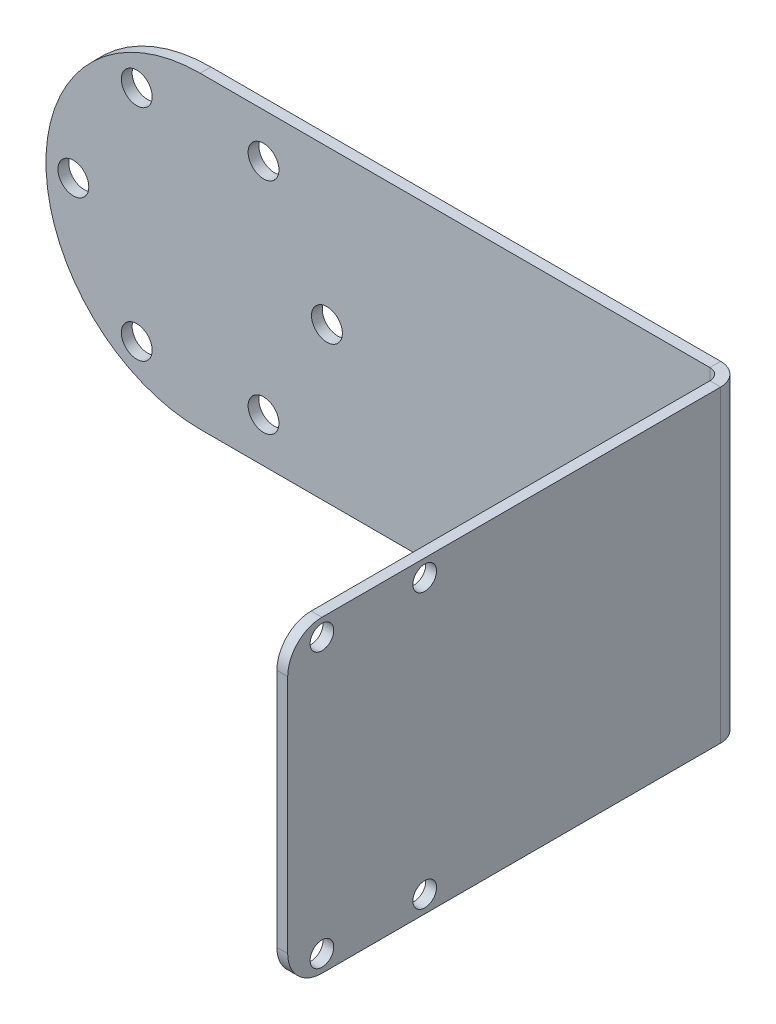
ISO-10303-21;
HEADER;
FILE_DESCRIPTION(('STEP AP214'),'2;1');
FILE_NAME('part.step','',(''),(''),'','','');
FILE_SCHEMA(('AUTOMOTIVE_DESIGN { 1 0 10303 214 1 1 1 1 }'));
ENDSEC;
DATA;
#1=APPLICATION_CONTEXT('core data for automotive mechanical design processes');
#2=APPLICATION_PROTOCOL_DEFINITION('international standard','automotive_design',2000,#1);
#3=PRODUCT_CONTEXT('',#1,'mechanical');
#4=PRODUCT('Part','Part','',(#3));
#5=PRODUCT_RELATED_PRODUCT_CATEGORY('part','',(#4));
#6=PRODUCT_DEFINITION_FORMATION('','',#4);
#7=PRODUCT_DEFINITION_CONTEXT('part definition',#1,'design');
#8=PRODUCT_DEFINITION('design','',#6,#7);
#9=PRODUCT_DEFINITION_SHAPE('','',#8);
#10=(LENGTH_UNIT() NAMED_UNIT(*) SI_UNIT(.MILLI.,.METRE.));
#11=(NAMED_UNIT(*) PLANE_ANGLE_UNIT() SI_UNIT($,.RADIAN.));
#12=(NAMED_UNIT(*) SI_UNIT($,.STERADIAN.) SOLID_ANGLE_UNIT());
#13=UNCERTAINTY_MEASURE_WITH_UNIT(LENGTH_MEASURE(1.E-05),#10,'distance_accuracy_value','');
#14=(GEOMETRIC_REPRESENTATION_CONTEXT(3) GLOBAL_UNCERTAINTY_ASSIGNED_CONTEXT((#13)) GLOBAL_UNIT_ASSIGNED_CONTEXT((#10,
#11,#12)) REPRESENTATION_CONTEXT('',''));
#15=CARTESIAN_POINT('',(0.,0.,0.));
#16=DIRECTION('',(0.,0.,1.));
#17=DIRECTION('',(1.,0.,0.));
#18=AXIS2_PLACEMENT_3D('',#15,#16,#17);
#19=CARTESIAN_POINT('',(77.6398205077934,0.,-76.3349794922068));
#20=DIRECTION('',(-1.,0.,0.));
#21=DIRECTION('',(0.,0.,1.));
#22=AXIS2_PLACEMENT_3D('',#19,#20,#21);
#23=PLANE('',#22);
#24=CARTESIAN_POINT('',(77.639820507793,20.,44.8650205077932));
#25=DIRECTION('',(-1.,0.,0.));
#26=DIRECTION('',(0.,0.,1.));
#27=AXIS2_PLACEMENT_3D('',#24,#25,#26);
#28=CIRCLE('',#27,1.725);
#29=CARTESIAN_POINT('',(77.639820507793,20.,46.5900205077932));
#30=VERTEX_POINT('',#29);
#31=EDGE_CURVE('E226',#30,#30,#28,.T.);
#32=ORIENTED_EDGE('',*,*,#31,.T.);
#33=EDGE_LOOP('',(#32));
#34=FACE_BOUND('',#33,.T.);
#35=CARTESIAN_POINT('',(77.639820507793,20.,59.8650205077932));
#36=DIRECTION('',(-1.,0.,0.));
#37=DIRECTION('',(0.,0.,1.));
#38=AXIS2_PLACEMENT_3D('',#35,#36,#37);
#39=CIRCLE('',#38,1.725);
#40=CARTESIAN_POINT('',(77.639820507793,20.,61.5900205077932));
#41=VERTEX_POINT('',#40);
#42=EDGE_CURVE('E220',#41,#41,#39,.T.);
#43=ORIENTED_EDGE('',*,*,#42,.T.);
#44=EDGE_LOOP('',(#43));
#45=FACE_BOUND('',#44,.T.);
#46=CARTESIAN_POINT('',(77.639820507793,-20.,59.8650205077932));
#47=DIRECTION('',(-1.,0.,0.));
#48=DIRECTION('',(0.,0.,1.));
#49=AXIS2_PLACEMENT_3D('',#46,#47,#48);
#50=CIRCLE('',#49,1.725);
#51=CARTESIAN_POINT('',(77.639820507793,-20.,61.5900205077932));
#52=VERTEX_POINT('',#51);
#53=EDGE_CURVE('E214',#52,#52,#50,.T.);
#54=ORIENTED_EDGE('',*,*,#53,.T.);
#55=EDGE_LOOP('',(#54));
#56=FACE_BOUND('',#55,.T.);
#57=CARTESIAN_POINT('',(77.639820507793,-20.,44.8650205077932));
#58=DIRECTION('',(-1.,0.,0.));
#59=DIRECTION('',(0.,0.,1.));
#60=AXIS2_PLACEMENT_3D('',#57,#58,#59);
#61=CIRCLE('',#60,1.725);
#62=CARTESIAN_POINT('',(77.639820507793,-20.,46.5900205077932));
#63=VERTEX_POINT('',#62);
#64=EDGE_CURVE('E206',#63,#63,#61,.T.);
#65=ORIENTED_EDGE('',*,*,#64,.T.);
#66=EDGE_LOOP('',(#65));
#67=FACE_BOUND('',#66,.T.);
#68=DIRECTION('',(0.,0.,-1.));
#69=VECTOR('',#68,1.);
#70=CARTESIAN_POINT('',(77.6398205077929,22.5,64.8650205077932));
#71=LINE('',#70,#69);
#72=CARTESIAN_POINT('',(77.6398205077929,22.5,59.8650205077932));
#73=VERTEX_POINT('',#72);
#74=CARTESIAN_POINT('',(77.6398205077931,22.5,1.67640000000001));
#75=VERTEX_POINT('',#74);
#76=EDGE_CURVE('E235',#73,#75,#71,.T.);
#77=ORIENTED_EDGE('',*,*,#76,.F.);
#78=CARTESIAN_POINT('',(77.639820507793,17.5,59.8650205077932));
#79=DIRECTION('',(-1.,0.,0.));
#80=DIRECTION('',(0.,0.,1.));
#81=AXIS2_PLACEMENT_3D('',#78,#79,#80);
#82=CIRCLE('',#81,5.);
#83=CARTESIAN_POINT('',(77.6398205077929,17.5,64.8650205077932));
#84=VERTEX_POINT('',#83);
#85=EDGE_CURVE('E55',#73,#84,#82,.F.);
#86=ORIENTED_EDGE('',*,*,#85,.T.);
#87=DIRECTION('',(0.,1.,0.));
#88=VECTOR('',#87,1.);
#89=CARTESIAN_POINT('',(77.6398205077929,-22.5,64.8650205077932));
#90=LINE('',#89,#88);
#91=CARTESIAN_POINT('',(77.6398205077929,-17.5,64.8650205077932));
#92=VERTEX_POINT('',#91);
#93=EDGE_CURVE('E232',#92,#84,#90,.T.);
#94=ORIENTED_EDGE('',*,*,#93,.F.);
#95=CARTESIAN_POINT('',(77.639820507793,-17.5,59.8650205077932));
#96=DIRECTION('',(-1.,0.,0.));
#97=DIRECTION('',(0.,0.,1.));
#98=AXIS2_PLACEMENT_3D('',#95,#96,#97);
#99=CIRCLE('',#98,5.);
#100=CARTESIAN_POINT('',(77.639820507793,-22.5,59.8650205077932));
#101=VERTEX_POINT('',#100);
#102=EDGE_CURVE('E62',#92,#101,#99,.F.);
#103=ORIENTED_EDGE('',*,*,#102,.T.);
#104=DIRECTION('',(0.,0.,1.));
#105=VECTOR('',#104,1.);
#106=CARTESIAN_POINT('',(77.6398205077934,-22.5,-76.3349794922067));
#107=LINE('',#106,#105);
#108=CARTESIAN_POINT('',(77.6398205077931,-22.5,1.67640000000001));
#109=VERTEX_POINT('',#108);
#110=EDGE_CURVE('E236',#109,#101,#107,.T.);
#111=ORIENTED_EDGE('',*,*,#110,.F.);
#112=DIRECTION('',(0.,1.,0.));
#113=VECTOR('',#112,1.);
#114=CARTESIAN_POINT('',(77.6398205077931,0.,1.67640000000001));
#115=LINE('',#114,#113);
#116=EDGE_CURVE('E148',#109,#75,#115,.T.);
#117=ORIENTED_EDGE('',*,*,#116,.T.);
#118=EDGE_LOOP('',(#77,#86,#94,#103,#111,#117));
#119=FACE_BOUND('',#118,.T.);
#120=ADVANCED_FACE('F47',(#34,#45,#56,#67,#119),#23,.F.);
#121=CARTESIAN_POINT('',(77.6398205077929,22.5,64.8650205077932));
#122=DIRECTION('',(0.,1.,0.));
#123=DIRECTION('',(-1.,0.,0.));
#124=AXIS2_PLACEMENT_3D('',#121,#122,#123);
#125=PLANE('',#124);
#126=DIRECTION('',(0.,0.,-1.));
#127=VECTOR('',#126,1.);
#128=CARTESIAN_POINT('',(76.0650205077929,22.5,64.8650205077932));
#129=LINE('',#128,#127);
#130=CARTESIAN_POINT('',(76.0650205077929,22.5,59.8650205077932));
#131=VERTEX_POINT('',#130);
#132=CARTESIAN_POINT('',(76.0650205077932,22.5,1.67640000000001));
#133=VERTEX_POINT('',#132);
#134=EDGE_CURVE('E240',#131,#133,#129,.T.);
#135=ORIENTED_EDGE('',*,*,#134,.F.);
#136=DIRECTION('',(-1.,0.,0.));
#137=VECTOR('',#136,1.);
#138=CARTESIAN_POINT('',(77.6398205077929,22.5,59.8650205077932));
#139=LINE('',#138,#137);
#140=EDGE_CURVE('E70',#131,#73,#139,.F.);
#141=ORIENTED_EDGE('',*,*,#140,.T.);
#142=ORIENTED_EDGE('',*,*,#76,.T.);
#143=DIRECTION('',(1.,0.,0.));
#144=VECTOR('',#143,1.);
#145=CARTESIAN_POINT('',(77.6398205077931,22.5,1.67640000000001));
#146=LINE('',#145,#144);
#147=EDGE_CURVE('E247',#133,#75,#146,.T.);
#148=ORIENTED_EDGE('',*,*,#147,.F.);
#149=EDGE_LOOP('',(#135,#141,#142,#148));
#150=FACE_BOUND('',#149,.T.);
#151=ADVANCED_FACE('F278',(#150),#125,.T.);
#152=CARTESIAN_POINT('',(77.6398205077929,-22.5,64.8650205077932));
#153=DIRECTION('',(0.,0.,1.));
#154=DIRECTION('',(1.,0.,0.));
#155=AXIS2_PLACEMENT_3D('',#152,#153,#154);
#156=PLANE('',#155);
#157=ORIENTED_EDGE('',*,*,#93,.T.);
#158=DIRECTION('',(-1.,0.,0.));
#159=VECTOR('',#158,1.);
#160=CARTESIAN_POINT('',(77.6398205077929,17.5,64.8650205077932));
#161=LINE('',#160,#159);
#162=CARTESIAN_POINT('',(76.0650205077929,17.5,64.8650205077932));
#163=VERTEX_POINT('',#162);
#164=EDGE_CURVE('E257',#84,#163,#161,.T.);
#165=ORIENTED_EDGE('',*,*,#164,.T.);
#166=DIRECTION('',(0.,1.,0.));
#167=VECTOR('',#166,1.);
#168=CARTESIAN_POINT('',(76.0650205077929,-22.5,64.8650205077932));
#169=LINE('',#168,#167);
#170=CARTESIAN_POINT('',(76.0650205077929,-17.5,64.8650205077932));
#171=VERTEX_POINT('',#170);
#172=EDGE_CURVE('E237',#171,#163,#169,.T.);
#173=ORIENTED_EDGE('',*,*,#172,.F.);
#174=DIRECTION('',(-1.,0.,0.));
#175=VECTOR('',#174,1.);
#176=CARTESIAN_POINT('',(77.6398205077929,-17.5,64.8650205077932));
#177=LINE('',#176,#175);
#178=EDGE_CURVE('E250',#171,#92,#177,.F.);
#179=ORIENTED_EDGE('',*,*,#178,.T.);
#180=EDGE_LOOP('',(#157,#165,#173,#179));
#181=FACE_BOUND('',#180,.T.);
#182=ADVANCED_FACE('F269',(#181),#156,.T.);
#183=CARTESIAN_POINT('',(77.6398205077934,-22.5,-76.3349794922067));
#184=DIRECTION('',(0.,-1.,0.));
#185=DIRECTION('',(1.,0.,0.));
#186=AXIS2_PLACEMENT_3D('',#183,#184,#185);
#187=PLANE('',#186);
#188=ORIENTED_EDGE('',*,*,#110,.T.);
#189=DIRECTION('',(-1.,0.,0.));
#190=VECTOR('',#189,1.);
#191=CARTESIAN_POINT('',(77.639820507793,-22.5,59.8650205077932));
#192=LINE('',#191,#190);
#193=CARTESIAN_POINT('',(76.065020507793,-22.5,59.8650205077932));
#194=VERTEX_POINT('',#193);
#195=EDGE_CURVE('E12',#101,#194,#192,.T.);
#196=ORIENTED_EDGE('',*,*,#195,.T.);
#197=DIRECTION('',(0.,0.,1.));
#198=VECTOR('',#197,1.);
#199=CARTESIAN_POINT('',(76.0650205077934,-22.5,-76.3349794922068));
#200=LINE('',#199,#198);
#201=CARTESIAN_POINT('',(76.0650205077932,-22.5,1.67640000000001));
#202=VERTEX_POINT('',#201);
#203=EDGE_CURVE('E229',#202,#194,#200,.T.);
#204=ORIENTED_EDGE('',*,*,#203,.F.);
#205=DIRECTION('',(-1.,0.,0.));
#206=VECTOR('',#205,1.);
#207=CARTESIAN_POINT('',(77.6398205077931,-22.5,1.67640000000001));
#208=LINE('',#207,#206);
#209=EDGE_CURVE('E242',#109,#202,#208,.T.);
#210=ORIENTED_EDGE('',*,*,#209,.F.);
#211=EDGE_LOOP('',(#188,#196,#204,#210));
#212=FACE_BOUND('',#211,.T.);
#213=ADVANCED_FACE('F290',(#212),#187,.T.);
#214=CARTESIAN_POINT('',(76.0650205077934,0.,-76.3349794922068));
#215=DIRECTION('',(-1.,0.,0.));
#216=DIRECTION('',(0.,0.,1.));
#217=AXIS2_PLACEMENT_3D('',#214,#215,#216);
#218=PLANE('',#217);
#219=ORIENTED_EDGE('',*,*,#172,.T.);
#220=CARTESIAN_POINT('',(76.065020507793,17.5,59.8650205077932));
#221=DIRECTION('',(-1.,0.,0.));
#222=DIRECTION('',(0.,0.,1.));
#223=AXIS2_PLACEMENT_3D('',#220,#221,#222);
#224=CIRCLE('',#223,5.);
#225=EDGE_CURVE('E262',#163,#131,#224,.T.);
#226=ORIENTED_EDGE('',*,*,#225,.T.);
#227=ORIENTED_EDGE('',*,*,#134,.T.);
#228=DIRECTION('',(0.,1.,0.));
#229=VECTOR('',#228,1.);
#230=CARTESIAN_POINT('',(76.0650205077932,0.,1.67640000000001));
#231=LINE('',#230,#229);
#232=EDGE_CURVE('E244',#202,#133,#231,.T.);
#233=ORIENTED_EDGE('',*,*,#232,.F.);
#234=ORIENTED_EDGE('',*,*,#203,.T.);
#235=CARTESIAN_POINT('',(76.065020507793,-17.5,59.8650205077932));
#236=DIRECTION('',(-1.,0.,0.));
#237=DIRECTION('',(0.,0.,1.));
#238=AXIS2_PLACEMENT_3D('',#235,#236,#237);
#239=CIRCLE('',#238,5.);
#240=EDGE_CURVE('E260',#194,#171,#239,.T.);
#241=ORIENTED_EDGE('',*,*,#240,.T.);
#242=EDGE_LOOP('',(#219,#226,#227,#233,#234,#241));
#243=FACE_BOUND('',#242,.T.);
#244=CARTESIAN_POINT('',(76.065020507793,-20.,44.8650205077932));
#245=DIRECTION('',(-1.,0.,0.));
#246=DIRECTION('',(0.,0.,1.));
#247=AXIS2_PLACEMENT_3D('',#244,#245,#246);
#248=CIRCLE('',#247,1.725);
#249=CARTESIAN_POINT('',(76.065020507793,-20.,46.5900205077932));
#250=VERTEX_POINT('',#249);
#251=EDGE_CURVE('E210',#250,#250,#248,.T.);
#252=ORIENTED_EDGE('',*,*,#251,.F.);
#253=EDGE_LOOP('',(#252));
#254=FACE_BOUND('',#253,.T.);
#255=CARTESIAN_POINT('',(76.065020507793,-20.,59.8650205077932));
#256=DIRECTION('',(-1.,0.,0.));
#257=DIRECTION('',(0.,0.,1.));
#258=AXIS2_PLACEMENT_3D('',#255,#256,#257);
#259=CIRCLE('',#258,1.725);
#260=CARTESIAN_POINT('',(76.065020507793,-20.,61.5900205077932));
#261=VERTEX_POINT('',#260);
#262=EDGE_CURVE('E209',#261,#261,#259,.T.);
#263=ORIENTED_EDGE('',*,*,#262,.F.);
#264=EDGE_LOOP('',(#263));
#265=FACE_BOUND('',#264,.T.);
#266=CARTESIAN_POINT('',(76.065020507793,20.,59.8650205077932));
#267=DIRECTION('',(-1.,0.,0.));
#268=DIRECTION('',(0.,0.,1.));
#269=AXIS2_PLACEMENT_3D('',#266,#267,#268);
#270=CIRCLE('',#269,1.725);
#271=CARTESIAN_POINT('',(76.065020507793,20.,61.5900205077932));
#272=VERTEX_POINT('',#271);
#273=EDGE_CURVE('E217',#272,#272,#270,.T.);
#274=ORIENTED_EDGE('',*,*,#273,.F.);
#275=EDGE_LOOP('',(#274));
#276=FACE_BOUND('',#275,.T.);
#277=CARTESIAN_POINT('',(76.065020507793,20.,44.8650205077932));
#278=DIRECTION('',(-1.,0.,0.));
#279=DIRECTION('',(0.,0.,1.));
#280=AXIS2_PLACEMENT_3D('',#277,#278,#279);
#281=CIRCLE('',#280,1.725);
#282=CARTESIAN_POINT('',(76.065020507793,20.,46.5900205077932));
#283=VERTEX_POINT('',#282);
#284=EDGE_CURVE('E223',#283,#283,#281,.T.);
#285=ORIENTED_EDGE('',*,*,#284,.F.);
#286=EDGE_LOOP('',(#285));
#287=FACE_BOUND('',#286,.T.);
#288=ADVANCED_FACE('F274',(#243,#254,#265,#276,#287),#218,.T.);
#289=CARTESIAN_POINT('',(77.639820507793,20.,44.8650205077932));
#290=DIRECTION('',(-1.,0.,0.));
#291=DIRECTION('',(0.,0.,1.));
#292=AXIS2_PLACEMENT_3D('',#289,#290,#291);
#293=CYLINDRICAL_SURFACE('',#292,1.725);
#294=ORIENTED_EDGE('',*,*,#31,.F.);
#295=EDGE_LOOP('',(#294));
#296=FACE_BOUND('',#295,.T.);
#297=ORIENTED_EDGE('',*,*,#284,.T.);
#298=EDGE_LOOP('',(#297));
#299=FACE_BOUND('',#298,.T.);
#300=ADVANCED_FACE('F311',(#296,#299),#293,.F.);
#301=CARTESIAN_POINT('',(77.639820507793,20.,59.8650205077932));
#302=DIRECTION('',(-1.,0.,0.));
#303=DIRECTION('',(0.,0.,1.));
#304=AXIS2_PLACEMENT_3D('',#301,#302,#303);
#305=CYLINDRICAL_SURFACE('',#304,1.725);
#306=ORIENTED_EDGE('',*,*,#42,.F.);
#307=EDGE_LOOP('',(#306));
#308=FACE_BOUND('',#307,.T.);
#309=ORIENTED_EDGE('',*,*,#273,.T.);
#310=EDGE_LOOP('',(#309));
#311=FACE_BOUND('',#310,.T.);
#312=ADVANCED_FACE('F315',(#308,#311),#305,.F.);
#313=CARTESIAN_POINT('',(77.639820507793,-20.,59.8650205077932));
#314=DIRECTION('',(-1.,0.,0.));
#315=DIRECTION('',(0.,0.,1.));
#316=AXIS2_PLACEMENT_3D('',#313,#314,#315);
#317=CYLINDRICAL_SURFACE('',#316,1.725);
#318=ORIENTED_EDGE('',*,*,#53,.F.);
#319=EDGE_LOOP('',(#318));
#320=FACE_BOUND('',#319,.T.);
#321=ORIENTED_EDGE('',*,*,#262,.T.);
#322=EDGE_LOOP('',(#321));
#323=FACE_BOUND('',#322,.T.);
#324=ADVANCED_FACE('F320',(#320,#323),#317,.F.);
#325=CARTESIAN_POINT('',(77.639820507793,-20.,44.8650205077932));
#326=DIRECTION('',(-1.,0.,0.));
#327=DIRECTION('',(0.,0.,1.));
#328=AXIS2_PLACEMENT_3D('',#325,#326,#327);
#329=CYLINDRICAL_SURFACE('',#328,1.725);
#330=ORIENTED_EDGE('',*,*,#64,.F.);
#331=EDGE_LOOP('',(#330));
#332=FACE_BOUND('',#331,.T.);
#333=ORIENTED_EDGE('',*,*,#251,.T.);
#334=EDGE_LOOP('',(#333));
#335=FACE_BOUND('',#334,.T.);
#336=ADVANCED_FACE('F328',(#332,#335),#329,.F.);
#337=CARTESIAN_POINT('',(9.2499999999999,16.0214699700122,-1.5748));
#338=DIRECTION('',(0.,0.,1.));
#339=DIRECTION('',(1.,0.,0.));
#340=AXIS2_PLACEMENT_3D('',#337,#338,#339);
#341=CYLINDRICAL_SURFACE('',#340,2.24999999999996);
#342=CARTESIAN_POINT('',(9.2499999999999,16.0214699700122,-1.5748));
#343=DIRECTION('',(0.,0.,1.));
#344=DIRECTION('',(1.,0.,0.));
#345=AXIS2_PLACEMENT_3D('',#342,#343,#344);
#346=CIRCLE('',#345,2.24999999999996);
#347=CARTESIAN_POINT('',(11.4999999999999,16.0214699700122,-1.5748));
#348=VERTEX_POINT('',#347);
#349=EDGE_CURVE('E165',#348,#348,#346,.T.);
#350=ORIENTED_EDGE('',*,*,#349,.F.);
#351=EDGE_LOOP('',(#350));
#352=FACE_BOUND('',#351,.T.);
#353=CARTESIAN_POINT('',(9.2499999999999,16.0214699700122,0.));
#354=DIRECTION('',(0.,0.,1.));
#355=DIRECTION('',(1.,0.,0.));
#356=AXIS2_PLACEMENT_3D('',#353,#354,#355);
#357=CIRCLE('',#356,2.24999999999996);
#358=CARTESIAN_POINT('',(11.4999999999999,16.0214699700122,0.));
#359=VERTEX_POINT('',#358);
#360=EDGE_CURVE('E161',#359,#359,#357,.T.);
#361=ORIENTED_EDGE('',*,*,#360,.T.);
#362=EDGE_LOOP('',(#361));
#363=FACE_BOUND('',#362,.T.);
#364=ADVANCED_FACE('F332',(#352,#363),#341,.F.);
#365=CARTESIAN_POINT('',(18.5000000000009,6.40112962635442E-13,-1.5748));
#366=DIRECTION('',(0.,0.,1.));
#367=DIRECTION('',(1.,0.,0.));
#368=AXIS2_PLACEMENT_3D('',#365,#366,#367);
#369=CYLINDRICAL_SURFACE('',#368,2.25000000000002);
#370=CARTESIAN_POINT('',(18.5000000000009,6.40112962635442E-13,-1.5748));
#371=DIRECTION('',(0.,0.,1.));
#372=DIRECTION('',(1.,0.,0.));
#373=AXIS2_PLACEMENT_3D('',#370,#371,#372);
#374=CIRCLE('',#373,2.25000000000002);
#375=CARTESIAN_POINT('',(20.7500000000009,6.40112962635442E-13,-1.5748));
#376=VERTEX_POINT('',#375);
#377=EDGE_CURVE('E168',#376,#376,#374,.T.);
#378=ORIENTED_EDGE('',*,*,#377,.F.);
#379=EDGE_LOOP('',(#378));
#380=FACE_BOUND('',#379,.T.);
#381=CARTESIAN_POINT('',(18.5000000000009,6.40112962635442E-13,0.));
#382=DIRECTION('',(0.,0.,1.));
#383=DIRECTION('',(1.,0.,0.));
#384=AXIS2_PLACEMENT_3D('',#381,#382,#383);
#385=CIRCLE('',#384,2.25000000000002);
#386=CARTESIAN_POINT('',(20.7500000000009,6.40112962635442E-13,0.));
#387=VERTEX_POINT('',#386);
#388=EDGE_CURVE('E201',#387,#387,#385,.T.);
#389=ORIENTED_EDGE('',*,*,#388,.T.);
#390=EDGE_LOOP('',(#389));
#391=FACE_BOUND('',#390,.T.);
#392=ADVANCED_FACE('F365',(#380,#391),#369,.F.);
#393=CARTESIAN_POINT('',(9.25000000000196,-16.021469970012,-1.5748));
#394=DIRECTION('',(0.,0.,1.));
#395=DIRECTION('',(1.,0.,0.));
#396=AXIS2_PLACEMENT_3D('',#393,#394,#395);
#397=CYLINDRICAL_SURFACE('',#396,2.25000000000001);
#398=CARTESIAN_POINT('',(9.25000000000196,-16.021469970012,-1.5748));
#399=DIRECTION('',(0.,0.,1.));
#400=DIRECTION('',(1.,0.,0.));
#401=AXIS2_PLACEMENT_3D('',#398,#399,#400);
#402=CIRCLE('',#401,2.25000000000001);
#403=CARTESIAN_POINT('',(11.500000000002,-16.021469970012,-1.5748));
#404=VERTEX_POINT('',#403);
#405=EDGE_CURVE('E174',#404,#404,#402,.T.);
#406=ORIENTED_EDGE('',*,*,#405,.F.);
#407=EDGE_LOOP('',(#406));
#408=FACE_BOUND('',#407,.T.);
#409=CARTESIAN_POINT('',(9.25000000000196,-16.021469970012,0.));
#410=DIRECTION('',(0.,0.,1.));
#411=DIRECTION('',(1.,0.,0.));
#412=AXIS2_PLACEMENT_3D('',#409,#410,#411);
#413=CIRCLE('',#412,2.25000000000001);
#414=CARTESIAN_POINT('',(11.500000000002,-16.021469970012,0.));
#415=VERTEX_POINT('',#414);
#416=EDGE_CURVE('E198',#415,#415,#413,.T.);
#417=ORIENTED_EDGE('',*,*,#416,.T.);
#418=EDGE_LOOP('',(#417));
#419=FACE_BOUND('',#418,.T.);
#420=ADVANCED_FACE('F361',(#408,#419),#397,.F.);
#421=CARTESIAN_POINT('',(-9.24999999999804,-16.0214699700133,-1.5748));
#422=DIRECTION('',(0.,0.,1.));
#423=DIRECTION('',(1.,0.,0.));
#424=AXIS2_PLACEMENT_3D('',#421,#422,#423);
#425=CYLINDRICAL_SURFACE('',#424,2.25);
#426=CARTESIAN_POINT('',(-9.24999999999804,-16.0214699700133,-1.5748));
#427=DIRECTION('',(0.,0.,1.));
#428=DIRECTION('',(1.,0.,0.));
#429=AXIS2_PLACEMENT_3D('',#426,#427,#428);
#430=CIRCLE('',#429,2.25);
#431=CARTESIAN_POINT('',(-6.99999999999804,-16.0214699700133,-1.5748));
#432=VERTEX_POINT('',#431);
#433=EDGE_CURVE('E177',#432,#432,#430,.T.);
#434=ORIENTED_EDGE('',*,*,#433,.F.);
#435=EDGE_LOOP('',(#434));
#436=FACE_BOUND('',#435,.T.);
#437=CARTESIAN_POINT('',(-9.24999999999804,-16.0214699700133,0.));
#438=DIRECTION('',(0.,0.,1.));
#439=DIRECTION('',(1.,0.,0.));
#440=AXIS2_PLACEMENT_3D('',#437,#438,#439);
#441=CIRCLE('',#440,2.25);
#442=CARTESIAN_POINT('',(-6.99999999999804,-16.0214699700133,0.));
#443=VERTEX_POINT('',#442);
#444=EDGE_CURVE('E195',#443,#443,#441,.T.);
#445=ORIENTED_EDGE('',*,*,#444,.T.);
#446=EDGE_LOOP('',(#445));
#447=FACE_BOUND('',#446,.T.);
#448=ADVANCED_FACE('F357',(#436,#447),#425,.F.);
#449=CARTESIAN_POINT('',(-18.4999999999991,-1.76941794549634E-12,-1.5748));
#450=DIRECTION('',(0.,0.,1.));
#451=DIRECTION('',(1.,0.,0.));
#452=AXIS2_PLACEMENT_3D('',#449,#450,#451);
#453=CYLINDRICAL_SURFACE('',#452,2.25);
#454=CARTESIAN_POINT('',(-18.4999999999991,-1.76941794549634E-12,-1.5748));
#455=DIRECTION('',(0.,0.,1.));
#456=DIRECTION('',(1.,0.,0.));
#457=AXIS2_PLACEMENT_3D('',#454,#455,#456);
#458=CIRCLE('',#457,2.25);
#459=CARTESIAN_POINT('',(-16.2499999999991,-1.76941794549634E-12,-1.5748));
#460=VERTEX_POINT('',#459);
#461=EDGE_CURVE('E180',#460,#460,#458,.T.);
#462=ORIENTED_EDGE('',*,*,#461,.F.);
#463=EDGE_LOOP('',(#462));
#464=FACE_BOUND('',#463,.T.);
#465=CARTESIAN_POINT('',(-18.4999999999991,-1.76941794549634E-12,0.));
#466=DIRECTION('',(0.,0.,1.));
#467=DIRECTION('',(1.,0.,0.));
#468=AXIS2_PLACEMENT_3D('',#465,#466,#467);
#469=CIRCLE('',#468,2.25);
#470=CARTESIAN_POINT('',(-16.2499999999991,-1.76941794549634E-12,0.));
#471=VERTEX_POINT('',#470);
#472=EDGE_CURVE('E192',#471,#471,#469,.T.);
#473=ORIENTED_EDGE('',*,*,#472,.T.);
#474=EDGE_LOOP('',(#473));
#475=FACE_BOUND('',#474,.T.);
#476=ADVANCED_FACE('F353',(#464,#475),#453,.F.);
#477=CARTESIAN_POINT('',(-9.25000000000011,16.021469970011,-1.5748));
#478=DIRECTION('',(0.,0.,1.));
#479=DIRECTION('',(1.,0.,0.));
#480=AXIS2_PLACEMENT_3D('',#477,#478,#479);
#481=CYLINDRICAL_SURFACE('',#480,2.24999999999991);
#482=CARTESIAN_POINT('',(-9.25000000000011,16.021469970011,-1.5748));
#483=DIRECTION('',(0.,0.,1.));
#484=DIRECTION('',(1.,0.,0.));
#485=AXIS2_PLACEMENT_3D('',#482,#483,#484);
#486=CIRCLE('',#485,2.24999999999991);
#487=CARTESIAN_POINT('',(-7.0000000000002,16.021469970011,-1.5748));
#488=VERTEX_POINT('',#487);
#489=EDGE_CURVE('E183',#488,#488,#486,.T.);
#490=ORIENTED_EDGE('',*,*,#489,.F.);
#491=EDGE_LOOP('',(#490));
#492=FACE_BOUND('',#491,.T.);
#493=CARTESIAN_POINT('',(-9.25000000000011,16.021469970011,0.));
#494=DIRECTION('',(0.,0.,1.));
#495=DIRECTION('',(1.,0.,0.));
#496=AXIS2_PLACEMENT_3D('',#493,#494,#495);
#497=CIRCLE('',#496,2.24999999999991);
#498=CARTESIAN_POINT('',(-7.0000000000002,16.021469970011,0.));
#499=VERTEX_POINT('',#498);
#500=EDGE_CURVE('E189',#499,#499,#497,.T.);
#501=ORIENTED_EDGE('',*,*,#500,.T.);
#502=EDGE_LOOP('',(#501));
#503=FACE_BOUND('',#502,.T.);
#504=ADVANCED_FACE('F349',(#492,#503),#481,.F.);
#505=CARTESIAN_POINT('',(0.,0.,-1.5748));
#506=DIRECTION('',(0.,0.,1.));
#507=DIRECTION('',(1.,0.,0.));
#508=AXIS2_PLACEMENT_3D('',#505,#506,#507);
#509=CYLINDRICAL_SURFACE('',#508,22.5);
#510=CARTESIAN_POINT('',(0.,0.,0.));
#511=DIRECTION('',(0.,0.,1.));
#512=DIRECTION('',(1.,0.,0.));
#513=AXIS2_PLACEMENT_3D('',#510,#511,#512);
#514=CIRCLE('',#513,22.5);
#515=CARTESIAN_POINT('',(0.,22.5,0.));
#516=VERTEX_POINT('',#515);
#517=CARTESIAN_POINT('',(0.,-22.5,0.));
#518=VERTEX_POINT('',#517);
#519=EDGE_CURVE('E648',#516,#518,#514,.T.);
#520=ORIENTED_EDGE('',*,*,#519,.F.);
#521=DIRECTION('',(0.,0.,1.));
#522=VECTOR('',#521,1.);
#523=CARTESIAN_POINT('',(0.,22.5,-1.5748));
#524=LINE('',#523,#522);
#525=CARTESIAN_POINT('',(0.,22.5,-1.5748));
#526=VERTEX_POINT('',#525);
#527=EDGE_CURVE('E213',#526,#516,#524,.T.);
#528=ORIENTED_EDGE('',*,*,#527,.F.);
#529=CARTESIAN_POINT('',(0.,0.,-1.5748));
#530=DIRECTION('',(0.,0.,1.));
#531=DIRECTION('',(1.,0.,0.));
#532=AXIS2_PLACEMENT_3D('',#529,#530,#531);
#533=CIRCLE('',#532,22.5);
#534=CARTESIAN_POINT('',(0.,-22.5,-1.5748));
#535=VERTEX_POINT('',#534);
#536=EDGE_CURVE('E187',#526,#535,#533,.T.);
#537=ORIENTED_EDGE('',*,*,#536,.T.);
#538=DIRECTION('',(0.,0.,1.));
#539=VECTOR('',#538,1.);
#540=CARTESIAN_POINT('',(0.,-22.5,-1.5748));
#541=LINE('',#540,#539);
#542=EDGE_CURVE('E164',#535,#518,#541,.T.);
#543=ORIENTED_EDGE('',*,*,#542,.T.);
#544=EDGE_LOOP('',(#520,#528,#537,#543));
#545=FACE_BOUND('',#544,.T.);
#546=ADVANCED_FACE('F346',(#545),#509,.T.);
#547=CARTESIAN_POINT('',(0.,0.,-1.5748));
#548=DIRECTION('',(0.,0.,1.));
#549=DIRECTION('',(1.,0.,0.));
#550=AXIS2_PLACEMENT_3D('',#547,#548,#549);
#551=PLANE('',#550);
#552=DIRECTION('',(0.,1.,0.));
#553=VECTOR('',#552,1.);
#554=CARTESIAN_POINT('',(74.3886205077932,0.,-1.5748));
#555=LINE('',#554,#553);
#556=CARTESIAN_POINT('',(74.3886205077932,-22.5,-1.5748));
#557=VERTEX_POINT('',#556);
#558=CARTESIAN_POINT('',(74.3886205077932,22.5,-1.5748));
#559=VERTEX_POINT('',#558);
#560=EDGE_CURVE('E145',#557,#559,#555,.T.);
#561=ORIENTED_EDGE('',*,*,#560,.F.);
#562=DIRECTION('',(1.,0.,0.));
#563=VECTOR('',#562,1.);
#564=CARTESIAN_POINT('',(0.,-22.5,-1.5748));
#565=LINE('',#564,#563);
#566=EDGE_CURVE('E139',#535,#557,#565,.T.);
#567=ORIENTED_EDGE('',*,*,#566,.F.);
#568=ORIENTED_EDGE('',*,*,#536,.F.);
#569=DIRECTION('',(-1.,0.,0.));
#570=VECTOR('',#569,1.);
#571=CARTESIAN_POINT('',(141.2,22.5,-1.5748));
#572=LINE('',#571,#570);
#573=EDGE_CURVE('E159',#559,#526,#572,.T.);
#574=ORIENTED_EDGE('',*,*,#573,.F.);
#575=EDGE_LOOP('',(#561,#567,#568,#574));
#576=FACE_BOUND('',#575,.T.);
#577=ORIENTED_EDGE('',*,*,#489,.T.);
#578=EDGE_LOOP('',(#577));
#579=FACE_BOUND('',#578,.T.);
#580=ORIENTED_EDGE('',*,*,#461,.T.);
#581=EDGE_LOOP('',(#580));
#582=FACE_BOUND('',#581,.T.);
#583=ORIENTED_EDGE('',*,*,#433,.T.);
#584=EDGE_LOOP('',(#583));
#585=FACE_BOUND('',#584,.T.);
#586=ORIENTED_EDGE('',*,*,#405,.T.);
#587=EDGE_LOOP('',(#586));
#588=FACE_BOUND('',#587,.T.);
#589=ORIENTED_EDGE('',*,*,#377,.T.);
#590=EDGE_LOOP('',(#589));
#591=FACE_BOUND('',#590,.T.);
#592=ORIENTED_EDGE('',*,*,#349,.T.);
#593=EDGE_LOOP('',(#592));
#594=FACE_BOUND('',#593,.T.);
#595=ADVANCED_FACE('F155',(#576,#579,#582,#585,#588,#591,#594),#551,.F.);
#596=CARTESIAN_POINT('',(0.,-22.5,-1.5748));
#597=DIRECTION('',(0.,-1.,0.));
#598=DIRECTION('',(0.,0.,-1.));
#599=AXIS2_PLACEMENT_3D('',#596,#597,#598);
#600=PLANE('',#599);
#601=ORIENTED_EDGE('',*,*,#566,.T.);
#602=DIRECTION('',(0.,0.,1.));
#603=VECTOR('',#602,1.);
#604=CARTESIAN_POINT('',(74.3886205077932,-22.5,-1.5748));
#605=LINE('',#604,#603);
#606=CARTESIAN_POINT('',(74.3886205077932,-22.5,0.));
#607=VERTEX_POINT('',#606);
#608=EDGE_CURVE('E126',#557,#607,#605,.T.);
#609=ORIENTED_EDGE('',*,*,#608,.T.);
#610=DIRECTION('',(1.,0.,0.));
#611=VECTOR('',#610,1.);
#612=CARTESIAN_POINT('',(0.,-22.5,0.));
#613=LINE('',#612,#611);
#614=EDGE_CURVE('E138',#518,#607,#613,.T.);
#615=ORIENTED_EDGE('',*,*,#614,.F.);
#616=ORIENTED_EDGE('',*,*,#542,.F.);
#617=EDGE_LOOP('',(#601,#609,#615,#616));
#618=FACE_BOUND('',#617,.T.);
#619=ADVANCED_FACE('F163',(#618),#600,.T.);
#620=CARTESIAN_POINT('',(0.,0.,0.));
#621=DIRECTION('',(0.,0.,1.));
#622=DIRECTION('',(1.,0.,0.));
#623=AXIS2_PLACEMENT_3D('',#620,#621,#622);
#624=PLANE('',#623);
#625=ORIENTED_EDGE('',*,*,#360,.F.);
#626=EDGE_LOOP('',(#625));
#627=FACE_BOUND('',#626,.T.);
#628=ORIENTED_EDGE('',*,*,#388,.F.);
#629=EDGE_LOOP('',(#628));
#630=FACE_BOUND('',#629,.T.);
#631=ORIENTED_EDGE('',*,*,#416,.F.);
#632=EDGE_LOOP('',(#631));
#633=FACE_BOUND('',#632,.T.);
#634=ORIENTED_EDGE('',*,*,#444,.F.);
#635=EDGE_LOOP('',(#634));
#636=FACE_BOUND('',#635,.T.);
#637=ORIENTED_EDGE('',*,*,#472,.F.);
#638=EDGE_LOOP('',(#637));
#639=FACE_BOUND('',#638,.T.);
#640=ORIENTED_EDGE('',*,*,#500,.F.);
#641=EDGE_LOOP('',(#640));
#642=FACE_BOUND('',#641,.T.);
#643=ORIENTED_EDGE('',*,*,#614,.T.);
#644=DIRECTION('',(0.,1.,0.));
#645=VECTOR('',#644,1.);
#646=CARTESIAN_POINT('',(74.3886205077932,0.,0.));
#647=LINE('',#646,#645);
#648=CARTESIAN_POINT('',(74.3886205077932,22.5,0.));
#649=VERTEX_POINT('',#648);
#650=EDGE_CURVE('E646',#607,#649,#647,.T.);
#651=ORIENTED_EDGE('',*,*,#650,.T.);
#652=DIRECTION('',(-1.,0.,0.));
#653=VECTOR('',#652,1.);
#654=CARTESIAN_POINT('',(141.2,22.5,0.));
#655=LINE('',#654,#653);
#656=EDGE_CURVE('E649',#649,#516,#655,.T.);
#657=ORIENTED_EDGE('',*,*,#656,.T.);
#658=ORIENTED_EDGE('',*,*,#519,.T.);
#659=EDGE_LOOP('',(#643,#651,#657,#658));
#660=FACE_BOUND('',#659,.T.);
#661=ADVANCED_FACE('F337',(#627,#630,#633,#636,#639,#642,#660),#624,.T.);
#662=CARTESIAN_POINT('',(141.2,22.5,-1.5748));
#663=DIRECTION('',(0.,1.,0.));
#664=DIRECTION('',(0.,0.,1.));
#665=AXIS2_PLACEMENT_3D('',#662,#663,#664);
#666=PLANE('',#665);
#667=ORIENTED_EDGE('',*,*,#656,.F.);
#668=DIRECTION('',(0.,0.,-1.));
#669=VECTOR('',#668,1.);
#670=CARTESIAN_POINT('',(74.3886205077932,22.5,-1.5748));
#671=LINE('',#670,#669);
#672=EDGE_CURVE('E283',#649,#559,#671,.T.);
#673=ORIENTED_EDGE('',*,*,#672,.T.);
#674=ORIENTED_EDGE('',*,*,#573,.T.);
#675=ORIENTED_EDGE('',*,*,#527,.T.);
#676=EDGE_LOOP('',(#667,#673,#674,#675));
#677=FACE_BOUND('',#676,.T.);
#678=ADVANCED_FACE('F334',(#677),#666,.T.);
#679=CARTESIAN_POINT('',(74.3886205077932,-22.5,1.6764));
#680=DIRECTION('',(0.,-1.,0.));
#681=DIRECTION('',(0.,0.,-1.));
#682=AXIS2_PLACEMENT_3D('',#679,#680,#681);
#683=PLANE('',#682);
#684=ORIENTED_EDGE('',*,*,#209,.T.);
#685=CARTESIAN_POINT('',(74.3886205077932,-22.5,1.6764));
#686=DIRECTION('',(0.,-1.,0.));
#687=DIRECTION('',(0.,0.,-1.));
#688=AXIS2_PLACEMENT_3D('',#685,#686,#687);
#689=CIRCLE('',#688,1.6764);
#690=EDGE_CURVE('E133',#202,#607,#689,.F.);
#691=ORIENTED_EDGE('',*,*,#690,.T.);
#692=ORIENTED_EDGE('',*,*,#608,.F.);
#693=CARTESIAN_POINT('',(74.3886205077932,-22.5,1.6764));
#694=DIRECTION('',(0.,1.,0.));
#695=DIRECTION('',(0.,0.,-1.));
#696=AXIS2_PLACEMENT_3D('',#693,#694,#695);
#697=CIRCLE('',#696,3.2512);
#698=EDGE_CURVE('E130',#109,#557,#697,.T.);
#699=ORIENTED_EDGE('',*,*,#698,.F.);
#700=EDGE_LOOP('',(#684,#691,#692,#699));
#701=FACE_BOUND('',#700,.T.);
#702=ADVANCED_FACE('F129',(#701),#683,.T.);
#703=CARTESIAN_POINT('',(74.3886205077932,22.5,1.6764));
#704=DIRECTION('',(0.,1.,0.));
#705=DIRECTION('',(0.,0.,1.));
#706=AXIS2_PLACEMENT_3D('',#703,#704,#705);
#707=PLANE('',#706);
#708=ORIENTED_EDGE('',*,*,#672,.F.);
#709=CARTESIAN_POINT('',(74.3886205077932,22.5,1.6764));
#710=DIRECTION('',(0.,-1.,0.));
#711=DIRECTION('',(0.,0.,-1.));
#712=AXIS2_PLACEMENT_3D('',#709,#710,#711);
#713=CIRCLE('',#712,1.6764);
#714=EDGE_CURVE('E150',#649,#133,#713,.T.);
#715=ORIENTED_EDGE('',*,*,#714,.T.);
#716=ORIENTED_EDGE('',*,*,#147,.T.);
#717=CARTESIAN_POINT('',(74.3886205077932,22.5,1.6764));
#718=DIRECTION('',(0.,-1.,0.));
#719=DIRECTION('',(0.,0.,1.));
#720=AXIS2_PLACEMENT_3D('',#717,#718,#719);
#721=CIRCLE('',#720,3.2512);
#722=EDGE_CURVE('E149',#559,#75,#721,.T.);
#723=ORIENTED_EDGE('',*,*,#722,.F.);
#724=EDGE_LOOP('',(#708,#715,#716,#723));
#725=FACE_BOUND('',#724,.T.);
#726=ADVANCED_FACE('F282',(#725),#707,.T.);
#727=CARTESIAN_POINT('',(74.3886205077932,45.1730492406606,1.6764));
#728=DIRECTION('',(0.,-1.,0.));
#729=DIRECTION('',(0.,0.,-1.));
#730=AXIS2_PLACEMENT_3D('',#727,#728,#729);
#731=CYLINDRICAL_SURFACE('',#730,3.2512);
#732=ORIENTED_EDGE('',*,*,#722,.T.);
#733=ORIENTED_EDGE('',*,*,#116,.F.);
#734=ORIENTED_EDGE('',*,*,#698,.T.);
#735=ORIENTED_EDGE('',*,*,#560,.T.);
#736=EDGE_LOOP('',(#732,#733,#734,#735));
#737=FACE_BOUND('',#736,.T.);
#738=ADVANCED_FACE('F144',(#737),#731,.T.);
#739=CARTESIAN_POINT('',(74.3886205077932,45.1730492406606,1.6764));
#740=DIRECTION('',(0.,-1.,0.));
#741=DIRECTION('',(0.,0.,-1.));
#742=AXIS2_PLACEMENT_3D('',#739,#740,#741);
#743=CYLINDRICAL_SURFACE('',#742,1.6764);
#744=ORIENTED_EDGE('',*,*,#714,.F.);
#745=ORIENTED_EDGE('',*,*,#650,.F.);
#746=ORIENTED_EDGE('',*,*,#690,.F.);
#747=ORIENTED_EDGE('',*,*,#232,.T.);
#748=EDGE_LOOP('',(#744,#745,#746,#747));
#749=FACE_BOUND('',#748,.T.);
#750=ADVANCED_FACE('F287',(#749),#743,.F.);
#751=CARTESIAN_POINT('',(77.6398205077929,17.5,59.8650205077932));
#752=DIRECTION('',(-1.,0.,0.));
#753=DIRECTION('',(0.,0.,1.));
#754=AXIS2_PLACEMENT_3D('',#751,#752,#753);
#755=CYLINDRICAL_SURFACE('',#754,5.);
#756=ORIENTED_EDGE('',*,*,#85,.F.);
#757=ORIENTED_EDGE('',*,*,#140,.F.);
#758=ORIENTED_EDGE('',*,*,#225,.F.);
#759=ORIENTED_EDGE('',*,*,#164,.F.);
#760=EDGE_LOOP('',(#756,#757,#758,#759));
#761=FACE_BOUND('',#760,.T.);
#762=ADVANCED_FACE('F272',(#761),#755,.T.);
#763=CARTESIAN_POINT('',(77.639820507793,-17.5,59.8650205077932));
#764=DIRECTION('',(-1.,0.,0.));
#765=DIRECTION('',(0.,0.,1.));
#766=AXIS2_PLACEMENT_3D('',#763,#764,#765);
#767=CYLINDRICAL_SURFACE('',#766,5.);
#768=ORIENTED_EDGE('',*,*,#102,.F.);
#769=ORIENTED_EDGE('',*,*,#178,.F.);
#770=ORIENTED_EDGE('',*,*,#240,.F.);
#771=ORIENTED_EDGE('',*,*,#195,.F.);
#772=EDGE_LOOP('',(#768,#769,#770,#771));
#773=FACE_BOUND('',#772,.T.);
#774=ADVANCED_FACE('F49',(#773),#767,.T.);
#775=CLOSED_SHELL('',(#120,#151,#182,#213,#288,#300,#312,#324,#336,#364,#392,#420,#448,#476,
#504,#546,#595,#619,#661,#678,#702,#726,#738,#750,#762,#774));
#776=MANIFOLD_SOLID_BREP('B2',#775);
#777=ADVANCED_BREP_SHAPE_REPRESENTATION('',(#18,#776),#14);
#778=SHAPE_DEFINITION_REPRESENTATION(#9,#777);
ENDSEC;
END-ISO-10303-21;
